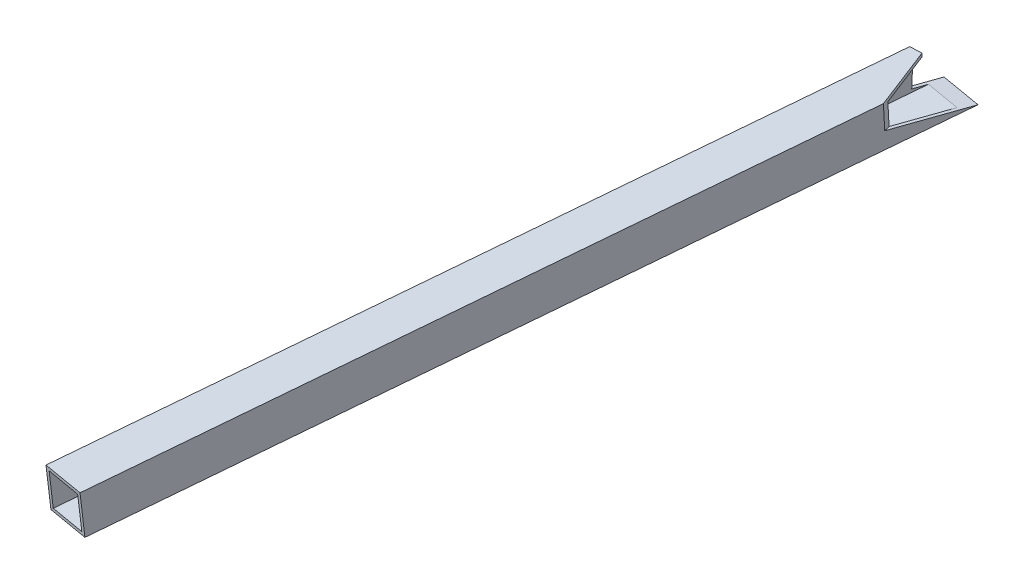
ISO-10303-21;
HEADER;
FILE_DESCRIPTION(('STEP AP214'),'2;1');
FILE_NAME('part.step','',(''),(''),'','','');
FILE_SCHEMA(('AUTOMOTIVE_DESIGN { 1 0 10303 214 1 1 1 1 }'));
ENDSEC;
DATA;
#1=APPLICATION_CONTEXT('core data for automotive mechanical design processes');
#2=APPLICATION_PROTOCOL_DEFINITION('international standard','automotive_design',2000,#1);
#3=PRODUCT_CONTEXT('',#1,'mechanical');
#4=PRODUCT('Part','Part','',(#3));
#5=PRODUCT_RELATED_PRODUCT_CATEGORY('part','',(#4));
#6=PRODUCT_DEFINITION_FORMATION('','',#4);
#7=PRODUCT_DEFINITION_CONTEXT('part definition',#1,'design');
#8=PRODUCT_DEFINITION('design','',#6,#7);
#9=PRODUCT_DEFINITION_SHAPE('','',#8);
#10=(LENGTH_UNIT() NAMED_UNIT(*) SI_UNIT(.MILLI.,.METRE.));
#11=(NAMED_UNIT(*) PLANE_ANGLE_UNIT() SI_UNIT($,.RADIAN.));
#12=(NAMED_UNIT(*) SI_UNIT($,.STERADIAN.) SOLID_ANGLE_UNIT());
#13=UNCERTAINTY_MEASURE_WITH_UNIT(LENGTH_MEASURE(1.E-05),#10,'distance_accuracy_value','');
#14=(GEOMETRIC_REPRESENTATION_CONTEXT(3) GLOBAL_UNCERTAINTY_ASSIGNED_CONTEXT((#13)) GLOBAL_UNIT_ASSIGNED_CONTEXT((#10,
#11,#12)) REPRESENTATION_CONTEXT('',''));
#15=CARTESIAN_POINT('',(0.,0.,0.));
#16=DIRECTION('',(0.,0.,1.));
#17=DIRECTION('',(1.,0.,0.));
#18=AXIS2_PLACEMENT_3D('',#15,#16,#17);
#19=CARTESIAN_POINT('',(50.9591217550329,-89.3327848660637,-1685.5822618358));
#20=DIRECTION('',(0.94343640931858,-0.0393485848218571,0.329210313393401));
#21=DIRECTION('',(0.329465469723453,0.,-0.944167625085665));
#22=AXIS2_PLACEMENT_3D('',#19,#20,#21);
#23=PLANE('',#22);
#24=DIRECTION('',(0.0416714946710182,0.999131366003432,0.));
#25=VECTOR('',#24,1.);
#26=CARTESIAN_POINT('',(157.000640852795,-93.7555352153645,-1990.));
#27=LINE('',#26,#25);
#28=CARTESIAN_POINT('',(160.493893550242,-9.99999999999999,-1990.));
#29=VERTEX_POINT('',#28);
#30=CARTESIAN_POINT('',(161.218326278322,7.36927045448499,-1990.));
#31=VERTEX_POINT('',#30);
#32=EDGE_CURVE('E142',#29,#31,#27,.T.);
#33=ORIENTED_EDGE('',*,*,#32,.F.);
#34=DIRECTION('',(-0.329465469723453,0.,0.944167625085665));
#35=VECTOR('',#34,1.);
#36=CARTESIAN_POINT('',(53.9087507521129,-10.,-1684.55299449257));
#37=LINE('',#36,#35);
#38=CARTESIAN_POINT('',(165.,-9.99999999999997,-2002.91340130006));
#39=VERTEX_POINT('',#38);
#40=EDGE_CURVE('E148',#39,#29,#37,.T.);
#41=ORIENTED_EDGE('',*,*,#40,.F.);
#42=DIRECTION('',(0.329210313393401,0.229015870186713,-0.916063480746854));
#43=VECTOR('',#42,1.);
#44=CARTESIAN_POINT('',(50.9591217550329,-89.3327848660637,-1685.5822618358));
#45=LINE('',#44,#43);
#46=CARTESIAN_POINT('',(50.,-89.9999999999996,-1682.91340130006));
#47=VERTEX_POINT('',#46);
#48=EDGE_CURVE('E197',#47,#39,#45,.T.);
#49=ORIENTED_EDGE('',*,*,#48,.F.);
#50=DIRECTION('',(0.,-0.992932622114171,-0.118679433523578));
#51=VECTOR('',#50,1.);
#52=CARTESIAN_POINT('',(50.,-89.656682806426,-1682.87236660229));
#53=LINE('',#52,#51);
#54=CARTESIAN_POINT('',(50.,-69.9999999999995,-1680.52291818206));
#55=VERTEX_POINT('',#54);
#56=EDGE_CURVE('E173',#55,#47,#53,.T.);
#57=ORIENTED_EDGE('',*,*,#56,.F.);
#58=DIRECTION('',(0.329210313393401,0.229015870186713,-0.916063480746854));
#59=VECTOR('',#58,1.);
#60=CARTESIAN_POINT('',(50.1721500585958,-69.8802434374981,-1681.00194443207));
#61=LINE('',#60,#59);
#62=EDGE_CURVE('E154',#55,#31,#61,.T.);
#63=ORIENTED_EDGE('',*,*,#62,.T.);
#64=EDGE_LOOP('',(#33,#41,#49,#57,#63));
#65=FACE_BOUND('',#64,.T.);
#66=ADVANCED_FACE('F41',(#65),#23,.F.);
#67=CARTESIAN_POINT('',(69.0408782449674,-70.6672151339353,-1674.4177381642));
#68=DIRECTION('',(0.0393485848218571,-0.972627071428273,-0.229015870186713));
#69=DIRECTION('',(0.,0.229193370242402,-0.973380911584427));
#70=AXIS2_PLACEMENT_3D('',#67,#68,#69);
#71=PLANE('',#70);
#72=DIRECTION('',(0.999182659857195,0.0404229172710405,0.));
#73=VECTOR('',#72,1.);
#74=CARTESIAN_POINT('',(66.0396131910564,3.51872200157198,-1990.));
#75=LINE('',#74,#73);
#76=CARTESIAN_POINT('',(167.192235935956,7.61095084544548,-1990.));
#77=VERTEX_POINT('',#76);
#78=EDGE_CURVE('E56',#31,#77,#75,.T.);
#79=ORIENTED_EDGE('',*,*,#78,.F.);
#80=ORIENTED_EDGE('',*,*,#62,.F.);
#81=DIRECTION('',(-0.985558600813723,0.,-0.169334711037329));
#82=VECTOR('',#81,1.);
#83=CARTESIAN_POINT('',(69.5137845521211,-69.9999999999995,-1677.17013828074));
#84=LINE('',#83,#82);
#85=CARTESIAN_POINT('',(70.,-69.9999999999995,-1677.08659869994));
#86=VERTEX_POINT('',#85);
#87=EDGE_CURVE('E176',#86,#55,#84,.T.);
#88=ORIENTED_EDGE('',*,*,#87,.F.);
#89=DIRECTION('',(0.329210313393401,0.229015870186713,-0.916063480746854));
#90=VECTOR('',#89,1.);
#91=CARTESIAN_POINT('',(69.0408782449674,-70.6672151339353,-1674.4177381642));
#92=LINE('',#91,#90);
#93=CARTESIAN_POINT('',(173.45316625647,1.96742000450108,-1964.95627871794));
#94=VERTEX_POINT('',#93);
#95=EDGE_CURVE('E157',#86,#94,#92,.T.);
#96=ORIENTED_EDGE('',*,*,#95,.T.);
#97=DIRECTION('',(0.236939542456569,-0.21357458825435,0.947758169826278));
#98=VECTOR('',#97,1.);
#99=CARTESIAN_POINT('',(236.510784218282,-54.8719941889432,-1712.7258068707));
#100=LINE('',#99,#98);
#101=EDGE_CURVE('E195',#77,#94,#100,.T.);
#102=ORIENTED_EDGE('',*,*,#101,.F.);
#103=EDGE_LOOP('',(#79,#80,#88,#96,#102));
#104=FACE_BOUND('',#103,.T.);
#105=ADVANCED_FACE('F235',(#104),#71,.F.);
#106=CARTESIAN_POINT('',(68.2553939507798,-88.5005955125006,-1679.15836667706));
#107=DIRECTION('',(-0.0393485848218587,0.972627071428274,0.229015870186713));
#108=DIRECTION('',(0.,-0.229193370242402,0.973380911584427));
#109=AXIS2_PLACEMENT_3D('',#106,#107,#108);
#110=PLANE('',#109);
#111=DIRECTION('',(-0.985558600813722,0.,-0.169334711037336));
#112=VECTOR('',#111,1.);
#113=CARTESIAN_POINT('',(123.894759494246,-10.,-2002.98952284853));
#114=LINE('',#113,#112);
#115=CARTESIAN_POINT('',(181.099999999999,-10.,-1993.16074872707));
#116=VERTEX_POINT('',#115);
#117=CARTESIAN_POINT('',(164.299999999999,-10.,-1996.04725709205));
#118=VERTEX_POINT('',#117);
#119=EDGE_CURVE('E168',#116,#118,#114,.T.);
#120=ORIENTED_EDGE('',*,*,#119,.T.);
#121=DIRECTION('',(0.329210313393401,0.229015870186713,-0.916063480746854));
#122=VECTOR('',#121,1.);
#123=CARTESIAN_POINT('',(52.4056622742277,-87.8395392874935,-1684.68909994207));
#124=LINE('',#123,#122);
#125=CARTESIAN_POINT('',(51.6000000000001,-88.3999999999996,-1682.44725709205));
#126=VERTEX_POINT('',#125);
#127=EDGE_CURVE('E153',#126,#118,#124,.T.);
#128=ORIENTED_EDGE('',*,*,#127,.F.);
#129=DIRECTION('',(0.985558600813724,0.,0.169334711037329));
#130=VECTOR('',#129,1.);
#131=CARTESIAN_POINT('',(68.3266936709353,-88.3999999999996,-1679.5733439254));
#132=LINE('',#131,#130);
#133=CARTESIAN_POINT('',(68.4000000000001,-88.3999999999996,-1679.56074872707));
#134=VERTEX_POINT('',#133);
#135=EDGE_CURVE('E164',#126,#134,#132,.T.);
#136=ORIENTED_EDGE('',*,*,#135,.T.);
#137=DIRECTION('',(0.329210313393401,0.229015870186713,-0.916063480746854));
#138=VECTOR('',#137,1.);
#139=CARTESIAN_POINT('',(68.2553939507798,-88.5005955125006,-1679.15836667706));
#140=LINE('',#139,#138);
#141=EDGE_CURVE('E167',#134,#116,#140,.T.);
#142=ORIENTED_EDGE('',*,*,#141,.T.);
#143=EDGE_LOOP('',(#120,#128,#136,#142));
#144=FACE_BOUND('',#143,.T.);
#145=ADVANCED_FACE('F43',(#144),#110,.T.);
#146=CARTESIAN_POINT('',(67.5943377257726,-72.1604607125056,-1675.31090005793));
#147=DIRECTION('',(0.0393485848218571,-0.972627071428273,-0.229015870186713));
#148=DIRECTION('',(0.,0.229193370242402,-0.973380911584427));
#149=AXIS2_PLACEMENT_3D('',#146,#147,#148);
#150=PLANE('',#149);
#151=DIRECTION('',(0.329210313393401,0.229015870186713,-0.916063480746854));
#152=VECTOR('',#151,1.);
#153=CARTESIAN_POINT('',(51.7446060492205,-71.4994044874984,-1680.84163332294));
#154=LINE('',#153,#152);
#155=CARTESIAN_POINT('',(51.6,-71.5999999999996,-1680.43925127293));
#156=VERTEX_POINT('',#155);
#157=CARTESIAN_POINT('',(162.84839407379,5.79018718176737,-1990.));
#158=VERTEX_POINT('',#157);
#159=EDGE_CURVE('E188',#156,#158,#154,.T.);
#160=ORIENTED_EDGE('',*,*,#159,.T.);
#161=DIRECTION('',(0.999182659857195,0.0404229172710405,0.));
#162=VECTOR('',#161,1.);
#163=CARTESIAN_POINT('',(64.6015668615019,1.81551515422024,-1990.));
#164=LINE('',#163,#162);
#165=CARTESIAN_POINT('',(167.192235935956,5.96592157677569,-1990.));
#166=VERTEX_POINT('',#165);
#167=EDGE_CURVE('E136',#158,#166,#164,.T.);
#168=ORIENTED_EDGE('',*,*,#167,.T.);
#169=DIRECTION('',(0.236939542456569,-0.21357458825435,0.947758169826278));
#170=VECTOR('',#169,1.);
#171=CARTESIAN_POINT('',(236.221324356017,-56.2561076549638,-1713.88364631976));
#172=LINE('',#171,#170);
#173=CARTESIAN_POINT('',(172.728029610417,0.97602059855139,-1967.85682530216));
#174=VERTEX_POINT('',#173);
#175=EDGE_CURVE('E64',#166,#174,#172,.T.);
#176=ORIENTED_EDGE('',*,*,#175,.T.);
#177=DIRECTION('',(0.329210313393401,0.229015870186713,-0.916063480746854));
#178=VECTOR('',#177,1.);
#179=CARTESIAN_POINT('',(67.5943377257726,-72.1604607125056,-1675.31090005793));
#180=LINE('',#179,#178);
#181=CARTESIAN_POINT('',(68.4,-71.5999999999996,-1677.55274290795));
#182=VERTEX_POINT('',#181);
#183=EDGE_CURVE('E202',#182,#174,#180,.T.);
#184=ORIENTED_EDGE('',*,*,#183,.F.);
#185=DIRECTION('',(-0.985558600813723,0.,-0.169334711037329));
#186=VECTOR('',#185,1.);
#187=CARTESIAN_POINT('',(67.9915790237817,-71.5999999999996,-1677.62291615583));
#188=LINE('',#187,#186);
#189=EDGE_CURVE('E183',#182,#156,#188,.T.);
#190=ORIENTED_EDGE('',*,*,#189,.T.);
#191=EDGE_LOOP('',(#160,#168,#176,#184,#190));
#192=FACE_BOUND('',#191,.T.);
#193=ADVANCED_FACE('F225',(#192),#150,.T.);
#194=CARTESIAN_POINT('',(52.4056622742277,-87.8395392874935,-1684.68909994207));
#195=DIRECTION('',(0.94343640931858,-0.0393485848218571,0.329210313393401));
#196=DIRECTION('',(0.329465469723453,0.,-0.944167625085665));
#197=AXIS2_PLACEMENT_3D('',#194,#195,#196);
#198=PLANE('',#197);
#199=ORIENTED_EDGE('',*,*,#127,.T.);
#200=DIRECTION('',(-0.329465469723453,0.,0.944167625085665));
#201=VECTOR('',#200,1.);
#202=CARTESIAN_POINT('',(55.299771722035,-10.,-1683.67920603836));
#203=LINE('',#202,#201);
#204=CARTESIAN_POINT('',(162.189821314102,-9.99999999999999,-1990.));
#205=VERTEX_POINT('',#204);
#206=EDGE_CURVE('E141',#118,#205,#203,.T.);
#207=ORIENTED_EDGE('',*,*,#206,.T.);
#208=DIRECTION('',(0.0416714946710182,0.999131366003432,0.));
#209=VECTOR('',#208,1.);
#210=CARTESIAN_POINT('',(158.758307276093,-92.2752659899506,-1990.));
#211=LINE('',#210,#209);
#212=EDGE_CURVE('E131',#205,#158,#211,.T.);
#213=ORIENTED_EDGE('',*,*,#212,.T.);
#214=ORIENTED_EDGE('',*,*,#159,.F.);
#215=DIRECTION('',(0.,-0.992932622114171,-0.118679433523578));
#216=VECTOR('',#215,1.);
#217=CARTESIAN_POINT('',(51.6000000000001,-88.1116135573979,-1682.41278794592));
#218=LINE('',#217,#216);
#219=EDGE_CURVE('E181',#156,#126,#218,.T.);
#220=ORIENTED_EDGE('',*,*,#219,.T.);
#221=EDGE_LOOP('',(#199,#207,#213,#214,#220));
#222=FACE_BOUND('',#221,.T.);
#223=ADVANCED_FACE('F150',(#222),#198,.T.);
#224=CARTESIAN_POINT('',(165.298574998547,10.,-1997.57464374964));
#225=DIRECTION('',(0.970142500145332,0.,-0.242535625036333));
#226=DIRECTION('',(-0.242535625036333,0.,-0.970142500145332));
#227=AXIS2_PLACEMENT_3D('',#224,#225,#226);
#228=PLANE('',#227);
#229=ORIENTED_EDGE('',*,*,#175,.F.);
#230=DIRECTION('',(0.,1.,0.));
#231=VECTOR('',#230,1.);
#232=CARTESIAN_POINT('',(167.192235935956,10.,-1990.));
#233=LINE('',#232,#231);
#234=EDGE_CURVE('E11',#166,#77,#233,.T.);
#235=ORIENTED_EDGE('',*,*,#234,.T.);
#236=ORIENTED_EDGE('',*,*,#101,.T.);
#237=DIRECTION('',(-0.0173640662442941,-0.997433865706837,-0.0694562649771766));
#238=VECTOR('',#237,1.);
#239=CARTESIAN_POINT('',(172.171895506037,-71.6318636909803,-1970.08136171967));
#240=LINE('',#239,#238);
#241=CARTESIAN_POINT('',(173.244828560231,-10.,-1965.7896295029));
#242=VERTEX_POINT('',#241);
#243=EDGE_CURVE('E49',#94,#242,#240,.T.);
#244=ORIENTED_EDGE('',*,*,#243,.T.);
#245=DIRECTION('',(0.242535625036333,0.,0.970142500145332));
#246=VECTOR('',#245,1.);
#247=CARTESIAN_POINT('',(165.298574998547,-10.,-1997.57464374964));
#248=LINE('',#247,#246);
#249=CARTESIAN_POINT('',(172.536950928086,-10.,-1968.62114003148));
#250=VERTEX_POINT('',#249);
#251=EDGE_CURVE('E190',#250,#242,#248,.T.);
#252=ORIENTED_EDGE('',*,*,#251,.F.);
#253=DIRECTION('',(-0.0173640662442941,-0.997433865706837,-0.0694562649771766));
#254=VECTOR('',#253,1.);
#255=CARTESIAN_POINT('',(171.495021848344,-69.8509205838266,-1972.78885635045));
#256=LINE('',#255,#254);
#257=EDGE_CURVE('E163',#174,#250,#256,.T.);
#258=ORIENTED_EDGE('',*,*,#257,.F.);
#259=EDGE_LOOP('',(#229,#235,#236,#244,#252,#258));
#260=FACE_BOUND('',#259,.T.);
#261=ADVANCED_FACE('F227',(#260),#228,.T.);
#262=CARTESIAN_POINT('',(69.8278499414044,-90.1197565625009,-1678.99805556793));
#263=DIRECTION('',(-0.94343640931858,0.0393485848218571,-0.329210313393401));
#264=DIRECTION('',(-0.329465469723453,0.,0.944167625085665));
#265=AXIS2_PLACEMENT_3D('',#262,#263,#264);
#266=PLANE('',#265);
#267=ORIENTED_EDGE('',*,*,#243,.F.);
#268=ORIENTED_EDGE('',*,*,#95,.F.);
#269=DIRECTION('',(0.,0.992932622114171,0.118679433523578));
#270=VECTOR('',#269,1.);
#271=CARTESIAN_POINT('',(69.9999999999999,-90.0616210347436,-1679.4844470201));
#272=LINE('',#271,#270);
#273=CARTESIAN_POINT('',(70.,-89.9999999999996,-1679.47708181794));
#274=VERTEX_POINT('',#273);
#275=EDGE_CURVE('E172',#274,#86,#272,.T.);
#276=ORIENTED_EDGE('',*,*,#275,.F.);
#277=DIRECTION('',(0.329210313393401,0.229015870186713,-0.916063480746854));
#278=VECTOR('',#277,1.);
#279=CARTESIAN_POINT('',(69.8278499414044,-90.1197565625009,-1678.99805556793));
#280=LINE('',#279,#278);
#281=CARTESIAN_POINT('',(184.999999999999,-9.99999999999998,-1999.47708181794));
#282=VERTEX_POINT('',#281);
#283=EDGE_CURVE('E211',#274,#282,#280,.T.);
#284=ORIENTED_EDGE('',*,*,#283,.T.);
#285=DIRECTION('',(0.329465469723453,0.,-0.944167625085665));
#286=VECTOR('',#285,1.);
#287=CARTESIAN_POINT('',(72.8067389038267,-10.,-1677.9585780163));
#288=LINE('',#287,#286);
#289=EDGE_CURVE('E191',#242,#282,#288,.T.);
#290=ORIENTED_EDGE('',*,*,#289,.F.);
#291=EDGE_LOOP('',(#267,#268,#276,#284,#290));
#292=FACE_BOUND('',#291,.T.);
#293=ADVANCED_FACE('F256',(#292),#266,.F.);
#294=CARTESIAN_POINT('',(69.8278499414044,-90.1197565625009,-1678.99805556793));
#295=DIRECTION('',(-0.0393485848218571,0.972627071428273,0.229015870186713));
#296=DIRECTION('',(0.,-0.229193370242402,0.973380911584427));
#297=AXIS2_PLACEMENT_3D('',#294,#295,#296);
#298=PLANE('',#297);
#299=DIRECTION('',(-0.985558600813723,0.,-0.169334711037329));
#300=VECTOR('',#299,1.);
#301=CARTESIAN_POINT('',(126.614838543605,-10.,-2009.5085852069));
#302=LINE('',#301,#300);
#303=EDGE_CURVE('E193',#282,#39,#302,.T.);
#304=ORIENTED_EDGE('',*,*,#303,.F.);
#305=ORIENTED_EDGE('',*,*,#283,.F.);
#306=DIRECTION('',(0.985558600813723,0.,0.169334711037329));
#307=VECTOR('',#306,1.);
#308=CARTESIAN_POINT('',(69.9127305606371,-89.9999999999996,-1679.49207610167));
#309=LINE('',#308,#307);
#310=EDGE_CURVE('E169',#47,#274,#309,.T.);
#311=ORIENTED_EDGE('',*,*,#310,.F.);
#312=ORIENTED_EDGE('',*,*,#48,.T.);
#313=EDGE_LOOP('',(#304,#305,#311,#312));
#314=FACE_BOUND('',#313,.T.);
#315=ADVANCED_FACE('F219',(#314),#298,.F.);
#316=CARTESIAN_POINT('',(68.2553939507798,-88.5005955125006,-1679.15836667706));
#317=DIRECTION('',(-0.94343640931858,0.0393485848218571,-0.329210313393401));
#318=DIRECTION('',(-0.329465469723453,0.,0.944167625085665));
#319=AXIS2_PLACEMENT_3D('',#316,#317,#318);
#320=PLANE('',#319);
#321=ORIENTED_EDGE('',*,*,#183,.T.);
#322=ORIENTED_EDGE('',*,*,#257,.T.);
#323=DIRECTION('',(0.329465469723453,0.,-0.944167625085665));
#324=VECTOR('',#323,1.);
#325=CARTESIAN_POINT('',(71.1740817694746,-10.,-1678.13989619829));
#326=LINE('',#325,#324);
#327=EDGE_CURVE('E79',#250,#116,#326,.T.);
#328=ORIENTED_EDGE('',*,*,#327,.T.);
#329=ORIENTED_EDGE('',*,*,#141,.F.);
#330=DIRECTION('',(0.,0.992932622114171,0.118679433523578));
#331=VECTOR('',#330,1.);
#332=CARTESIAN_POINT('',(68.4,-88.4517616691844,-1679.56693549689));
#333=LINE('',#332,#331);
#334=EDGE_CURVE('E162',#134,#182,#333,.T.);
#335=ORIENTED_EDGE('',*,*,#334,.T.);
#336=EDGE_LOOP('',(#321,#322,#328,#329,#335));
#337=FACE_BOUND('',#336,.T.);
#338=ADVANCED_FACE('F229',(#337),#320,.T.);
#339=CARTESIAN_POINT('',(60.,-80.,-1680.));
#340=DIRECTION('',(-0.168171921974834,-0.116989163112928,0.978790958465303));
#341=DIRECTION('',(0.985558600813723,0.,0.169334711037329));
#342=AXIS2_PLACEMENT_3D('',#339,#340,#341);
#343=PLANE('',#342);
#344=ORIENTED_EDGE('',*,*,#219,.F.);
#345=ORIENTED_EDGE('',*,*,#189,.F.);
#346=ORIENTED_EDGE('',*,*,#334,.F.);
#347=ORIENTED_EDGE('',*,*,#135,.F.);
#348=EDGE_LOOP('',(#344,#345,#346,#347));
#349=FACE_BOUND('',#348,.T.);
#350=ORIENTED_EDGE('',*,*,#56,.T.);
#351=ORIENTED_EDGE('',*,*,#310,.T.);
#352=ORIENTED_EDGE('',*,*,#275,.T.);
#353=ORIENTED_EDGE('',*,*,#87,.T.);
#354=EDGE_LOOP('',(#350,#351,#352,#353));
#355=FACE_BOUND('',#354,.T.);
#356=ADVANCED_FACE('F231',(#349,#355),#343,.T.);
#357=CARTESIAN_POINT('',(184.701425001453,-10.,-2002.42535625036));
#358=DIRECTION('',(0.,1.,0.));
#359=DIRECTION('',(0.,0.,1.));
#360=AXIS2_PLACEMENT_3D('',#357,#358,#359);
#361=PLANE('',#360);
#362=ORIENTED_EDGE('',*,*,#119,.F.);
#363=ORIENTED_EDGE('',*,*,#327,.F.);
#364=ORIENTED_EDGE('',*,*,#251,.T.);
#365=ORIENTED_EDGE('',*,*,#289,.T.);
#366=ORIENTED_EDGE('',*,*,#303,.T.);
#367=ORIENTED_EDGE('',*,*,#40,.T.);
#368=DIRECTION('',(-1.,0.,0.));
#369=VECTOR('',#368,1.);
#370=CARTESIAN_POINT('',(175.,-10.,-1990.));
#371=LINE('',#370,#369);
#372=EDGE_CURVE('E134',#205,#29,#371,.T.);
#373=ORIENTED_EDGE('',*,*,#372,.F.);
#374=ORIENTED_EDGE('',*,*,#206,.F.);
#375=EDGE_LOOP('',(#362,#363,#364,#365,#366,#367,#373,#374));
#376=FACE_BOUND('',#375,.T.);
#377=ADVANCED_FACE('F145',(#376),#361,.T.);
#378=CARTESIAN_POINT('',(175.,-10.,-1990.));
#379=DIRECTION('',(0.,0.,-1.));
#380=DIRECTION('',(-1.,0.,0.));
#381=AXIS2_PLACEMENT_3D('',#378,#379,#380);
#382=PLANE('',#381);
#383=ORIENTED_EDGE('',*,*,#372,.T.);
#384=ORIENTED_EDGE('',*,*,#32,.T.);
#385=ORIENTED_EDGE('',*,*,#78,.T.);
#386=ORIENTED_EDGE('',*,*,#234,.F.);
#387=ORIENTED_EDGE('',*,*,#167,.F.);
#388=ORIENTED_EDGE('',*,*,#212,.F.);
#389=EDGE_LOOP('',(#383,#384,#385,#386,#387,#388));
#390=FACE_BOUND('',#389,.T.);
#391=ADVANCED_FACE('F133',(#390),#382,.T.);
#392=CLOSED_SHELL('',(#66,#105,#145,#193,#223,#261,#293,#315,#338,#356,#377,#391));
#393=MANIFOLD_SOLID_BREP('B2',#392);
#394=ADVANCED_BREP_SHAPE_REPRESENTATION('',(#18,#393),#14);
#395=SHAPE_DEFINITION_REPRESENTATION(#9,#394);
ENDSEC;
END-ISO-10303-21;
